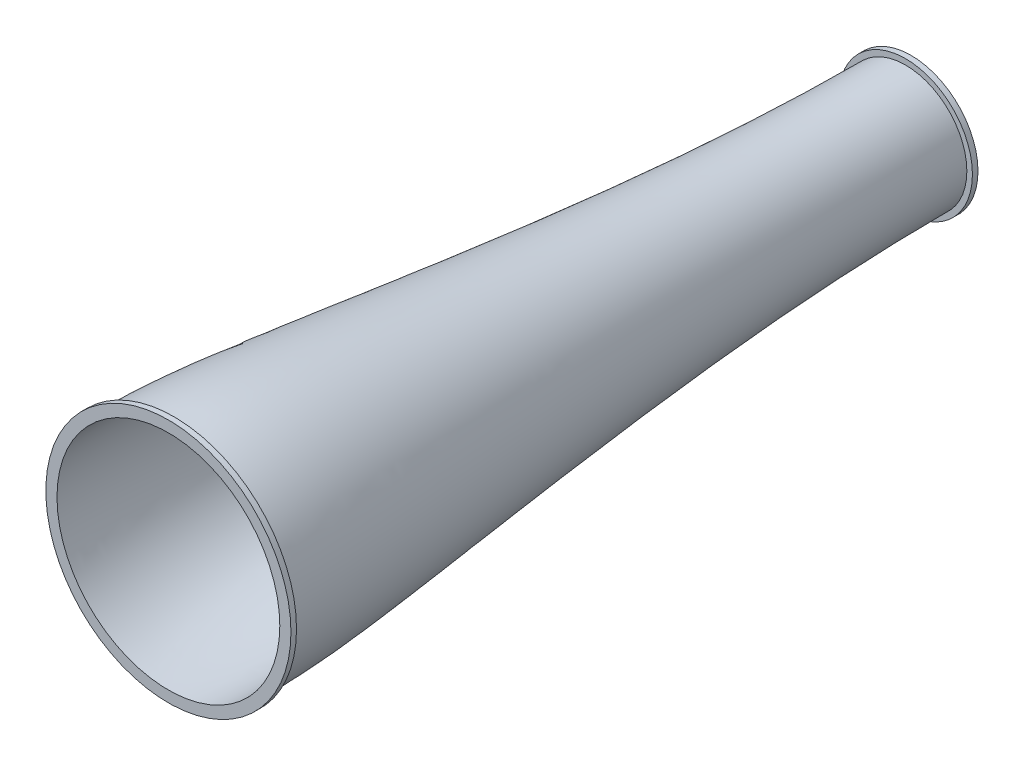
ISO-10303-21;
HEADER;
FILE_DESCRIPTION(('STEP AP214'),'2;1');
FILE_NAME('part.step','',(''),(''),'','','');
FILE_SCHEMA(('AUTOMOTIVE_DESIGN { 1 0 10303 214 1 1 1 1 }'));
ENDSEC;
DATA;
#1=APPLICATION_CONTEXT('core data for automotive mechanical design processes');
#2=APPLICATION_PROTOCOL_DEFINITION('international standard','automotive_design',2000,#1);
#3=PRODUCT_CONTEXT('',#1,'mechanical');
#4=PRODUCT('Part','Part','',(#3));
#5=PRODUCT_RELATED_PRODUCT_CATEGORY('part','',(#4));
#6=PRODUCT_DEFINITION_FORMATION('','',#4);
#7=PRODUCT_DEFINITION_CONTEXT('part definition',#1,'design');
#8=PRODUCT_DEFINITION('design','',#6,#7);
#9=PRODUCT_DEFINITION_SHAPE('','',#8);
#10=(LENGTH_UNIT() NAMED_UNIT(*) SI_UNIT(.MILLI.,.METRE.));
#11=(NAMED_UNIT(*) PLANE_ANGLE_UNIT() SI_UNIT($,.RADIAN.));
#12=(NAMED_UNIT(*) SI_UNIT($,.STERADIAN.) SOLID_ANGLE_UNIT());
#13=UNCERTAINTY_MEASURE_WITH_UNIT(LENGTH_MEASURE(1.E-05),#10,'distance_accuracy_value','');
#14=(GEOMETRIC_REPRESENTATION_CONTEXT(3) GLOBAL_UNCERTAINTY_ASSIGNED_CONTEXT((#13)) GLOBAL_UNIT_ASSIGNED_CONTEXT((#10,
#11,#12)) REPRESENTATION_CONTEXT('',''));
#15=CARTESIAN_POINT('',(0.,0.,0.));
#16=DIRECTION('',(0.,0.,1.));
#17=DIRECTION('',(1.,0.,0.));
#18=AXIS2_PLACEMENT_3D('',#15,#16,#17);
#19=CARTESIAN_POINT('',(0.,300.,0.));
#20=CARTESIAN_POINT('',(0.,300.,-210.));
#21=CARTESIAN_POINT('',(0.,293.543921125606,-320.));
#22=CARTESIAN_POINT('',(0.,231.831314371843,-740.));
#23=CARTESIAN_POINT('',(0.,170.439033920389,-1240.));
#24=CARTESIAN_POINT('',(0.,150.000000000001,-1630.));
#25=CARTESIAN_POINT('',(0.,150.,-2000.));
#26=B_SPLINE_CURVE_WITH_KNOTS('',6,(#19,#20,#21,#22,#23,#24,#25),.UNSPECIFIED.,.F.,.F.,(7,7),
(0.,1.),.UNSPECIFIED.);
#27=CARTESIAN_POINT('',(0.,0.,0.));
#28=DIRECTION('',(0.,0.,1.));
#29=AXIS1_PLACEMENT('',#27,#28);
#30=SURFACE_OF_REVOLUTION('',#26,#29);
#31=CARTESIAN_POINT('',(0.,0.,-2000.));
#32=DIRECTION('',(0.,0.,1.));
#33=DIRECTION('',(1.,0.,0.));
#34=AXIS2_PLACEMENT_3D('',#31,#32,#33);
#35=CIRCLE('',#34,150.);
#36=CARTESIAN_POINT('',(150.,0.,-2000.));
#37=VERTEX_POINT('',#36);
#38=EDGE_CURVE('E10',#37,#37,#35,.T.);
#39=ORIENTED_EDGE('',*,*,#38,.F.);
#40=EDGE_LOOP('',(#39));
#41=FACE_BOUND('',#40,.T.);
#42=CARTESIAN_POINT('',(0.,0.,0.));
#43=DIRECTION('',(0.,0.,1.));
#44=DIRECTION('',(1.,0.,0.));
#45=AXIS2_PLACEMENT_3D('',#42,#43,#44);
#46=CIRCLE('',#45,300.);
#47=CARTESIAN_POINT('',(300.,0.,0.));
#48=VERTEX_POINT('',#47);
#49=EDGE_CURVE('E70',#48,#48,#46,.T.);
#50=ORIENTED_EDGE('',*,*,#49,.T.);
#51=EDGE_LOOP('',(#50));
#52=FACE_BOUND('',#51,.T.);
#53=ADVANCED_FACE('F41',(#41,#52),#30,.T.);
#54=CARTESIAN_POINT('',(0.,150.,-2000.));
#55=DIRECTION('',(0.,0.,1.));
#56=DIRECTION('',(1.,0.,0.));
#57=AXIS2_PLACEMENT_3D('',#54,#55,#56);
#58=PLANE('',#57);
#59=CARTESIAN_POINT('',(0.,0.,-2000.));
#60=DIRECTION('',(0.,0.,1.));
#61=DIRECTION('',(1.,0.,0.));
#62=AXIS2_PLACEMENT_3D('',#59,#60,#61);
#63=CIRCLE('',#62,180.);
#64=CARTESIAN_POINT('',(180.,0.,-2000.));
#65=VERTEX_POINT('',#64);
#66=EDGE_CURVE('E48',#65,#65,#63,.T.);
#67=ORIENTED_EDGE('',*,*,#66,.F.);
#68=EDGE_LOOP('',(#67));
#69=FACE_BOUND('',#68,.T.);
#70=ORIENTED_EDGE('',*,*,#38,.T.);
#71=EDGE_LOOP('',(#70));
#72=FACE_BOUND('',#71,.T.);
#73=ADVANCED_FACE('F96',(#69,#72),#58,.F.);
#74=CARTESIAN_POINT('',(0.,0.,0.));
#75=DIRECTION('',(0.,0.,1.));
#76=DIRECTION('',(1.,0.,0.));
#77=AXIS2_PLACEMENT_3D('',#74,#75,#76);
#78=CYLINDRICAL_SURFACE('',#77,180.);
#79=CARTESIAN_POINT('',(0.,0.,-1985.));
#80=DIRECTION('',(0.,0.,1.));
#81=DIRECTION('',(1.,0.,0.));
#82=AXIS2_PLACEMENT_3D('',#79,#80,#81);
#83=CIRCLE('',#82,180.);
#84=CARTESIAN_POINT('',(180.,0.,-1985.));
#85=VERTEX_POINT('',#84);
#86=EDGE_CURVE('E52',#85,#85,#83,.T.);
#87=ORIENTED_EDGE('',*,*,#86,.F.);
#88=EDGE_LOOP('',(#87));
#89=FACE_BOUND('',#88,.T.);
#90=ORIENTED_EDGE('',*,*,#66,.T.);
#91=EDGE_LOOP('',(#90));
#92=FACE_BOUND('',#91,.T.);
#93=ADVANCED_FACE('F93',(#89,#92),#78,.T.);
#94=CARTESIAN_POINT('',(0.,165.014121282901,-1985.));
#95=DIRECTION('',(0.,0.,-1.));
#96=DIRECTION('',(-1.,0.,0.));
#97=AXIS2_PLACEMENT_3D('',#94,#95,#96);
#98=PLANE('',#97);
#99=CARTESIAN_POINT('',(0.,0.,-1985.));
#100=DIRECTION('',(0.,0.,1.));
#101=DIRECTION('',(1.,0.,0.));
#102=AXIS2_PLACEMENT_3D('',#99,#100,#101);
#103=CIRCLE('',#102,165.014121282901);
#104=CARTESIAN_POINT('',(165.014121282901,0.,-1985.));
#105=VERTEX_POINT('',#104);
#106=EDGE_CURVE('E56',#105,#105,#103,.T.);
#107=ORIENTED_EDGE('',*,*,#106,.F.);
#108=EDGE_LOOP('',(#107));
#109=FACE_BOUND('',#108,.T.);
#110=ORIENTED_EDGE('',*,*,#86,.T.);
#111=EDGE_LOOP('',(#110));
#112=FACE_BOUND('',#111,.T.);
#113=ADVANCED_FACE('F88',(#109,#112),#98,.F.);
#114=CARTESIAN_POINT('',(0.,165.014121282901,-1985.));
#115=CARTESIAN_POINT('',(0.,165.024850728388,-1979.320576613));
#116=CARTESIAN_POINT('',(0.,165.058571086232,-1967.97200237187));
#117=CARTESIAN_POINT('',(0.,165.176606044135,-1945.1930356165));
#118=CARTESIAN_POINT('',(0.,165.421263812217,-1916.60925807547));
#119=CARTESIAN_POINT('',(0.,165.87685874295,-1882.08641491154));
#120=CARTESIAN_POINT('',(0.,166.707432636104,-1835.73421524111));
#121=CARTESIAN_POINT('',(0.,168.175327409953,-1777.13852987024));
#122=CARTESIAN_POINT('',(0.,170.646274098017,-1705.68328327682));
#123=CARTESIAN_POINT('',(0.,173.83209978068,-1633.07015837956));
#124=CARTESIAN_POINT('',(0.,179.018985360505,-1534.78036701599));
#125=CARTESIAN_POINT('',(0.,187.209904509346,-1409.41174331322));
#126=CARTESIAN_POINT('',(0.,199.430813152682,-1256.48467818292));
#127=CARTESIAN_POINT('',(0.,213.526416344874,-1103.30310632073));
#128=CARTESIAN_POINT('',(0.,228.853987910262,-952.528685444836));
#129=CARTESIAN_POINT('',(0.,244.6873350889,-807.019582078681));
#130=CARTESIAN_POINT('',(0.,260.265063825474,-669.564665614601));
#131=CARTESIAN_POINT('',(0.,274.840823981218,-542.604012587317));
#132=CARTESIAN_POINT('',(0.,287.736124543206,-427.933239114959));
#133=CARTESIAN_POINT('',(0.,298.396745066527,-326.383444619407));
#134=CARTESIAN_POINT('',(0.,305.10433176703,-252.32924226229));
#135=CARTESIAN_POINT('',(0.,309.100808054428,-198.369603382434));
#136=CARTESIAN_POINT('',(0.,311.427553989329,-160.082693170425));
#137=CARTESIAN_POINT('',(0.,313.114325041835,-123.421056933631));
#138=CARTESIAN_POINT('',(0.,314.032861048496,-93.6379618508135));
#139=CARTESIAN_POINT('',(0.,314.516858175918,-69.8419126624447));
#140=CARTESIAN_POINT('',(0.,314.725972324225,-54.87782591437));
#141=CARTESIAN_POINT('',(0.,314.844628523956,-42.7841437824419));
#142=CARTESIAN_POINT('',(0.,314.911370317946,-33.6354286022096));
#143=CARTESIAN_POINT('',(0.,314.950240779285,-25.9274314179801));
#144=CARTESIAN_POINT('',(0.,314.972413618706,-19.7078538756601));
#145=CARTESIAN_POINT('',(0.,314.980750544791,-16.56667001468));
#146=CARTESIAN_POINT('',(0.,314.984254865298,-14.9999999999981));
#147=B_SPLINE_CURVE_WITH_KNOTS('',3,(#114,#115,#116,#117,#118,#119,#120,#121,#122,#123,#124,
#125,#126,#127,#128,#129,#130,#131,#132,#133,#134,#135,#136,#137,#138,#139,#140,#141,#142,#143,
#144,#145,#146),.UNSPECIFIED.,.F.,.F.,(4,1,1,1,1,1,1,1,1,1,1,1,1,1,1,1,1,1,1,1,1,1,1,1,1,1,1,1,
1,1,4),(0.0120394944386824,0.0197050992197667,0.0273707040008511,0.0427019135630198,
0.0580331231251885,0.0733643326873571,0.104026751811694,0.134689170936032,0.165351590060369,
0.196014009184707,0.257338847433381,0.318663685682056,0.379988523930731,0.441313362179406,
0.50263820042808,0.563963038676755,0.62528787692543,0.686612715174105,0.747937553422779,
0.809262391671454,0.839924810795792,0.870587229920129,0.901249649044466,0.931912068168804,
0.947243277730972,0.962574487293141,0.970240092074225,0.97790569685531,0.985571301636394,
0.989404104026936,0.993236906417478),.UNSPECIFIED.);
#148=CARTESIAN_POINT('',(0.,0.,0.));
#149=DIRECTION('',(0.,0.,1.));
#150=AXIS1_PLACEMENT('',#148,#149);
#151=SURFACE_OF_REVOLUTION('',#147,#150);
#152=CARTESIAN_POINT('',(0.,0.,-14.9999999999981));
#153=DIRECTION('',(0.,0.,1.));
#154=DIRECTION('',(1.,0.,0.));
#155=AXIS2_PLACEMENT_3D('',#152,#153,#154);
#156=CIRCLE('',#155,314.984254865298);
#157=CARTESIAN_POINT('',(314.984254865298,0.,-14.9999999999981));
#158=VERTEX_POINT('',#157);
#159=EDGE_CURVE('E61',#158,#158,#156,.T.);
#160=ORIENTED_EDGE('',*,*,#159,.F.);
#161=EDGE_LOOP('',(#160));
#162=FACE_BOUND('',#161,.T.);
#163=ORIENTED_EDGE('',*,*,#106,.T.);
#164=EDGE_LOOP('',(#163));
#165=FACE_BOUND('',#164,.T.);
#166=ADVANCED_FACE('F83',(#162,#165),#151,.T.);
#167=CARTESIAN_POINT('',(0.,330.,-14.9999999999991));
#168=DIRECTION('',(0.,0.,1.));
#169=DIRECTION('',(1.,0.,0.));
#170=AXIS2_PLACEMENT_3D('',#167,#168,#169);
#171=PLANE('',#170);
#172=CARTESIAN_POINT('',(0.,0.,-15.));
#173=DIRECTION('',(0.,0.,1.));
#174=DIRECTION('',(1.,0.,0.));
#175=AXIS2_PLACEMENT_3D('',#172,#173,#174);
#176=CIRCLE('',#175,330.);
#177=CARTESIAN_POINT('',(330.,0.,-15.));
#178=VERTEX_POINT('',#177);
#179=EDGE_CURVE('E64',#178,#178,#176,.T.);
#180=ORIENTED_EDGE('',*,*,#179,.F.);
#181=EDGE_LOOP('',(#180));
#182=FACE_BOUND('',#181,.T.);
#183=ORIENTED_EDGE('',*,*,#159,.T.);
#184=EDGE_LOOP('',(#183));
#185=FACE_BOUND('',#184,.T.);
#186=ADVANCED_FACE('F87',(#182,#185),#171,.F.);
#187=CARTESIAN_POINT('',(0.,0.,0.));
#188=DIRECTION('',(0.,0.,1.));
#189=DIRECTION('',(1.,0.,0.));
#190=AXIS2_PLACEMENT_3D('',#187,#188,#189);
#191=CYLINDRICAL_SURFACE('',#190,330.);
#192=CARTESIAN_POINT('',(0.,0.,0.));
#193=DIRECTION('',(0.,0.,1.));
#194=DIRECTION('',(1.,0.,0.));
#195=AXIS2_PLACEMENT_3D('',#192,#193,#194);
#196=CIRCLE('',#195,330.);
#197=CARTESIAN_POINT('',(330.,0.,0.));
#198=VERTEX_POINT('',#197);
#199=EDGE_CURVE('E67',#198,#198,#196,.T.);
#200=ORIENTED_EDGE('',*,*,#199,.F.);
#201=EDGE_LOOP('',(#200));
#202=FACE_BOUND('',#201,.T.);
#203=ORIENTED_EDGE('',*,*,#179,.T.);
#204=EDGE_LOOP('',(#203));
#205=FACE_BOUND('',#204,.T.);
#206=ADVANCED_FACE('F112',(#202,#205),#191,.T.);
#207=CARTESIAN_POINT('',(0.,330.,0.));
#208=DIRECTION('',(0.,0.,-1.));
#209=DIRECTION('',(-1.,0.,0.));
#210=AXIS2_PLACEMENT_3D('',#207,#208,#209);
#211=PLANE('',#210);
#212=ORIENTED_EDGE('',*,*,#49,.F.);
#213=EDGE_LOOP('',(#212));
#214=FACE_BOUND('',#213,.T.);
#215=ORIENTED_EDGE('',*,*,#199,.T.);
#216=EDGE_LOOP('',(#215));
#217=FACE_BOUND('',#216,.T.);
#218=ADVANCED_FACE('F109',(#214,#217),#211,.F.);
#219=CLOSED_SHELL('',(#53,#73,#93,#113,#166,#186,#206,#218));
#220=MANIFOLD_SOLID_BREP('B2',#219);
#221=ADVANCED_BREP_SHAPE_REPRESENTATION('',(#18,#220),#14);
#222=SHAPE_DEFINITION_REPRESENTATION(#9,#221);
ENDSEC;
END-ISO-10303-21;
